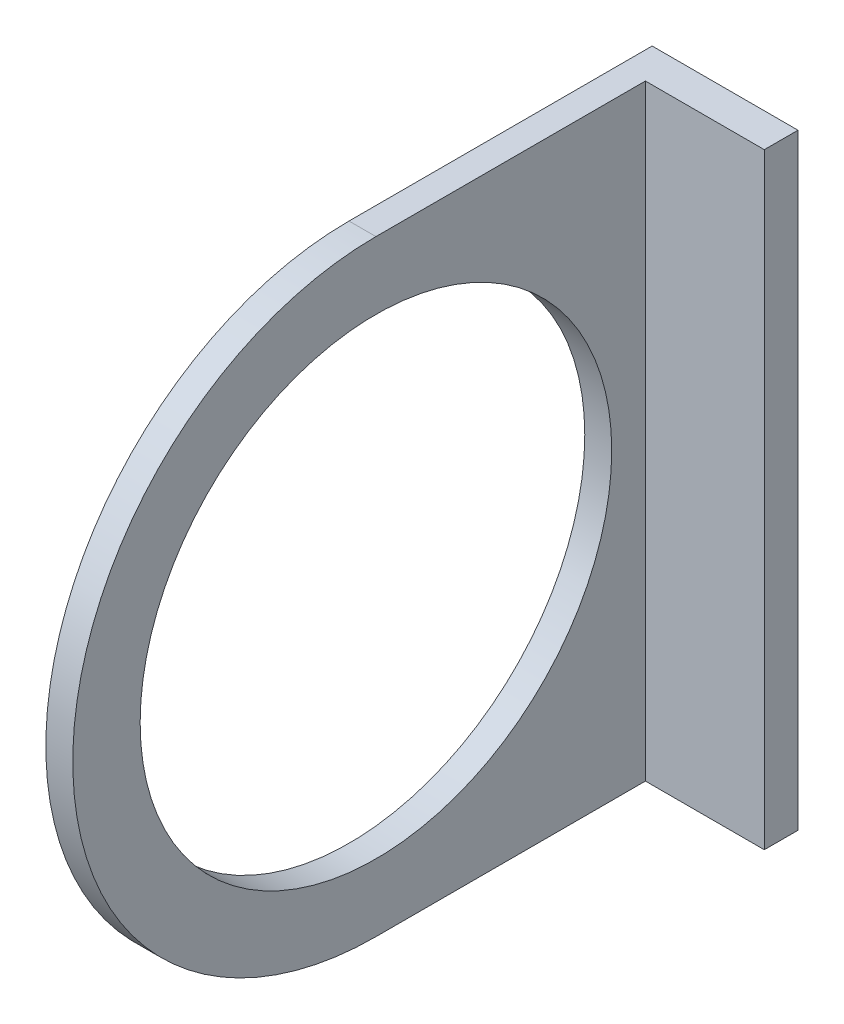
ISO-10303-21;
HEADER;
FILE_DESCRIPTION(('STEP AP214'),'2;1');
FILE_NAME('part.step','',(''),(''),'','','');
FILE_SCHEMA(('AUTOMOTIVE_DESIGN { 1 0 10303 214 1 1 1 1 }'));
ENDSEC;
DATA;
#1=APPLICATION_CONTEXT('core data for automotive mechanical design processes');
#2=APPLICATION_PROTOCOL_DEFINITION('international standard','automotive_design',2000,#1);
#3=PRODUCT_CONTEXT('',#1,'mechanical');
#4=PRODUCT('Part','Part','',(#3));
#5=PRODUCT_RELATED_PRODUCT_CATEGORY('part','',(#4));
#6=PRODUCT_DEFINITION_FORMATION('','',#4);
#7=PRODUCT_DEFINITION_CONTEXT('part definition',#1,'design');
#8=PRODUCT_DEFINITION('design','',#6,#7);
#9=PRODUCT_DEFINITION_SHAPE('','',#8);
#10=(LENGTH_UNIT() NAMED_UNIT(*) SI_UNIT(.MILLI.,.METRE.));
#11=(NAMED_UNIT(*) PLANE_ANGLE_UNIT() SI_UNIT($,.RADIAN.));
#12=(NAMED_UNIT(*) SI_UNIT($,.STERADIAN.) SOLID_ANGLE_UNIT());
#13=UNCERTAINTY_MEASURE_WITH_UNIT(LENGTH_MEASURE(1.E-05),#10,'distance_accuracy_value','');
#14=(GEOMETRIC_REPRESENTATION_CONTEXT(3) GLOBAL_UNCERTAINTY_ASSIGNED_CONTEXT((#13)) GLOBAL_UNIT_ASSIGNED_CONTEXT((#10,
#11,#12)) REPRESENTATION_CONTEXT('',''));
#15=CARTESIAN_POINT('',(0.,0.,0.));
#16=DIRECTION('',(0.,0.,1.));
#17=DIRECTION('',(1.,0.,0.));
#18=AXIS2_PLACEMENT_3D('',#15,#16,#17);
#19=CARTESIAN_POINT('',(0.,180.,0.));
#20=DIRECTION('',(0.,-1.,0.));
#21=DIRECTION('',(0.,0.,-1.));
#22=AXIS2_PLACEMENT_3D('',#19,#20,#21);
#23=PLANE('',#22);
#24=DIRECTION('',(1.,0.,0.));
#25=VECTOR('',#24,1.);
#26=CARTESIAN_POINT('',(-172.,180.,90.));
#27=LINE('',#26,#25);
#28=CARTESIAN_POINT('',(-1.11022302462516E-13,180.,90.));
#29=VERTEX_POINT('',#28);
#30=CARTESIAN_POINT('',(7.99999999999998,180.,90.));
#31=VERTEX_POINT('',#30);
#32=EDGE_CURVE('E97',#29,#31,#27,.T.);
#33=ORIENTED_EDGE('',*,*,#32,.T.);
#34=DIRECTION('',(0.,0.,-1.));
#35=VECTOR('',#34,1.);
#36=CARTESIAN_POINT('',(7.99999999999997,180.,10.));
#37=LINE('',#36,#35);
#38=CARTESIAN_POINT('',(7.99999999999997,180.,10.));
#39=VERTEX_POINT('',#38);
#40=EDGE_CURVE('E86',#31,#39,#37,.T.);
#41=ORIENTED_EDGE('',*,*,#40,.T.);
#42=DIRECTION('',(1.,0.,0.));
#43=VECTOR('',#42,1.);
#44=CARTESIAN_POINT('',(43.3000000000001,180.,10.));
#45=LINE('',#44,#43);
#46=CARTESIAN_POINT('',(43.3000000000001,180.,10.));
#47=VERTEX_POINT('',#46);
#48=EDGE_CURVE('E108',#39,#47,#45,.T.);
#49=ORIENTED_EDGE('',*,*,#48,.T.);
#50=DIRECTION('',(0.,0.,-1.));
#51=VECTOR('',#50,1.);
#52=CARTESIAN_POINT('',(43.3000000000001,180.,0.));
#53=LINE('',#52,#51);
#54=CARTESIAN_POINT('',(43.3000000000001,180.,0.));
#55=VERTEX_POINT('',#54);
#56=EDGE_CURVE('E110',#47,#55,#53,.T.);
#57=ORIENTED_EDGE('',*,*,#56,.T.);
#58=DIRECTION('',(-1.,0.,0.));
#59=VECTOR('',#58,1.);
#60=CARTESIAN_POINT('',(0.,180.,0.));
#61=LINE('',#60,#59);
#62=CARTESIAN_POINT('',(0.,180.,0.));
#63=VERTEX_POINT('',#62);
#64=EDGE_CURVE('E58',#55,#63,#61,.T.);
#65=ORIENTED_EDGE('',*,*,#64,.T.);
#66=DIRECTION('',(0.,0.,1.));
#67=VECTOR('',#66,1.);
#68=CARTESIAN_POINT('',(0.,180.,300.));
#69=LINE('',#68,#67);
#70=EDGE_CURVE('E102',#63,#29,#69,.T.);
#71=ORIENTED_EDGE('',*,*,#70,.T.);
#72=EDGE_LOOP('',(#33,#41,#49,#57,#65,#71));
#73=FACE_BOUND('',#72,.T.);
#74=ADVANCED_FACE('F35',(#73),#23,.F.);
#75=CARTESIAN_POINT('',(0.,0.,0.));
#76=DIRECTION('',(0.,-1.,0.));
#77=DIRECTION('',(0.,0.,-1.));
#78=AXIS2_PLACEMENT_3D('',#75,#76,#77);
#79=PLANE('',#78);
#80=DIRECTION('',(0.,0.,-1.));
#81=VECTOR('',#80,1.);
#82=CARTESIAN_POINT('',(7.99999999999997,0.,10.));
#83=LINE('',#82,#81);
#84=CARTESIAN_POINT('',(7.99999999999998,0.,90.));
#85=VERTEX_POINT('',#84);
#86=CARTESIAN_POINT('',(7.99999999999997,0.,10.));
#87=VERTEX_POINT('',#86);
#88=EDGE_CURVE('E121',#85,#87,#83,.T.);
#89=ORIENTED_EDGE('',*,*,#88,.F.);
#90=DIRECTION('',(1.,0.,0.));
#91=VECTOR('',#90,1.);
#92=CARTESIAN_POINT('',(-172.,0.,90.));
#93=LINE('',#92,#91);
#94=CARTESIAN_POINT('',(0.,0.,90.));
#95=VERTEX_POINT('',#94);
#96=EDGE_CURVE('E11',#85,#95,#93,.F.);
#97=ORIENTED_EDGE('',*,*,#96,.T.);
#98=DIRECTION('',(0.,0.,1.));
#99=VECTOR('',#98,1.);
#100=CARTESIAN_POINT('',(0.,0.,300.));
#101=LINE('',#100,#99);
#102=CARTESIAN_POINT('',(0.,0.,0.));
#103=VERTEX_POINT('',#102);
#104=EDGE_CURVE('E118',#103,#95,#101,.T.);
#105=ORIENTED_EDGE('',*,*,#104,.F.);
#106=DIRECTION('',(-1.,0.,0.));
#107=VECTOR('',#106,1.);
#108=CARTESIAN_POINT('',(0.,0.,0.));
#109=LINE('',#108,#107);
#110=CARTESIAN_POINT('',(43.3000000000001,0.,0.));
#111=VERTEX_POINT('',#110);
#112=EDGE_CURVE('E79',#111,#103,#109,.T.);
#113=ORIENTED_EDGE('',*,*,#112,.F.);
#114=DIRECTION('',(0.,0.,-1.));
#115=VECTOR('',#114,1.);
#116=CARTESIAN_POINT('',(43.3000000000001,0.,0.));
#117=LINE('',#116,#115);
#118=CARTESIAN_POINT('',(43.3000000000001,0.,10.));
#119=VERTEX_POINT('',#118);
#120=EDGE_CURVE('E126',#119,#111,#117,.T.);
#121=ORIENTED_EDGE('',*,*,#120,.F.);
#122=DIRECTION('',(1.,0.,0.));
#123=VECTOR('',#122,1.);
#124=CARTESIAN_POINT('',(43.3000000000001,0.,10.));
#125=LINE('',#124,#123);
#126=EDGE_CURVE('E124',#87,#119,#125,.T.);
#127=ORIENTED_EDGE('',*,*,#126,.F.);
#128=EDGE_LOOP('',(#89,#97,#105,#113,#121,#127));
#129=FACE_BOUND('',#128,.T.);
#130=ADVANCED_FACE('F140',(#129),#79,.T.);
#131=CARTESIAN_POINT('',(0.,180.,300.));
#132=DIRECTION('',(1.,0.,0.));
#133=DIRECTION('',(0.,0.,-1.));
#134=AXIS2_PLACEMENT_3D('',#131,#132,#133);
#135=PLANE('',#134);
#136=CARTESIAN_POINT('',(0.,90.,90.));
#137=DIRECTION('',(1.,0.,0.));
#138=DIRECTION('',(0.,0.,-1.));
#139=AXIS2_PLACEMENT_3D('',#136,#137,#138);
#140=CIRCLE('',#139,70.);
#141=CARTESIAN_POINT('',(0.,90.,20.));
#142=VERTEX_POINT('',#141);
#143=EDGE_CURVE('E122',#142,#142,#140,.T.);
#144=ORIENTED_EDGE('',*,*,#143,.T.);
#145=EDGE_LOOP('',(#144));
#146=FACE_BOUND('',#145,.T.);
#147=ORIENTED_EDGE('',*,*,#104,.T.);
#148=CARTESIAN_POINT('',(0.,90.,90.));
#149=DIRECTION('',(1.,0.,0.));
#150=DIRECTION('',(0.,0.,-1.));
#151=AXIS2_PLACEMENT_3D('',#148,#149,#150);
#152=CIRCLE('',#151,90.);
#153=EDGE_CURVE('E50',#95,#29,#152,.F.);
#154=ORIENTED_EDGE('',*,*,#153,.T.);
#155=ORIENTED_EDGE('',*,*,#70,.F.);
#156=DIRECTION('',(0.,-1.,0.));
#157=VECTOR('',#156,1.);
#158=CARTESIAN_POINT('',(0.,180.,0.));
#159=LINE('',#158,#157);
#160=EDGE_CURVE('E117',#63,#103,#159,.T.);
#161=ORIENTED_EDGE('',*,*,#160,.T.);
#162=EDGE_LOOP('',(#147,#154,#155,#161));
#163=FACE_BOUND('',#162,.T.);
#164=ADVANCED_FACE('F37',(#146,#163),#135,.F.);
#165=CARTESIAN_POINT('',(7.99999999999997,180.,10.));
#166=DIRECTION('',(-1.,0.,0.));
#167=DIRECTION('',(0.,0.,1.));
#168=AXIS2_PLACEMENT_3D('',#165,#166,#167);
#169=PLANE('',#168);
#170=CARTESIAN_POINT('',(7.99999999999998,90.,90.));
#171=DIRECTION('',(1.,0.,0.));
#172=DIRECTION('',(0.,0.,-1.));
#173=AXIS2_PLACEMENT_3D('',#170,#171,#172);
#174=CIRCLE('',#173,70.);
#175=CARTESIAN_POINT('',(7.99999999999995,90.,20.));
#176=VERTEX_POINT('',#175);
#177=EDGE_CURVE('E103',#176,#176,#174,.T.);
#178=ORIENTED_EDGE('',*,*,#177,.F.);
#179=EDGE_LOOP('',(#178));
#180=FACE_BOUND('',#179,.T.);
#181=ORIENTED_EDGE('',*,*,#40,.F.);
#182=CARTESIAN_POINT('',(7.99999999999998,90.,90.));
#183=DIRECTION('',(-1.,0.,0.));
#184=DIRECTION('',(0.,0.,-1.));
#185=AXIS2_PLACEMENT_3D('',#182,#183,#184);
#186=CIRCLE('',#185,90.);
#187=EDGE_CURVE('E95',#85,#31,#186,.T.);
#188=ORIENTED_EDGE('',*,*,#187,.F.);
#189=ORIENTED_EDGE('',*,*,#88,.T.);
#190=DIRECTION('',(0.,-1.,0.));
#191=VECTOR('',#190,1.);
#192=CARTESIAN_POINT('',(7.99999999999997,180.,10.));
#193=LINE('',#192,#191);
#194=EDGE_CURVE('E43',#39,#87,#193,.T.);
#195=ORIENTED_EDGE('',*,*,#194,.F.);
#196=EDGE_LOOP('',(#181,#188,#189,#195));
#197=FACE_BOUND('',#196,.T.);
#198=ADVANCED_FACE('F105',(#180,#197),#169,.F.);
#199=CARTESIAN_POINT('',(43.3000000000001,180.,10.));
#200=DIRECTION('',(0.,0.,-1.));
#201=DIRECTION('',(-1.,0.,0.));
#202=AXIS2_PLACEMENT_3D('',#199,#200,#201);
#203=PLANE('',#202);
#204=ORIENTED_EDGE('',*,*,#126,.T.);
#205=DIRECTION('',(0.,-1.,0.));
#206=VECTOR('',#205,1.);
#207=CARTESIAN_POINT('',(43.3000000000001,180.,10.));
#208=LINE('',#207,#206);
#209=EDGE_CURVE('E132',#47,#119,#208,.T.);
#210=ORIENTED_EDGE('',*,*,#209,.F.);
#211=ORIENTED_EDGE('',*,*,#48,.F.);
#212=ORIENTED_EDGE('',*,*,#194,.T.);
#213=EDGE_LOOP('',(#204,#210,#211,#212));
#214=FACE_BOUND('',#213,.T.);
#215=ADVANCED_FACE('F136',(#214),#203,.F.);
#216=CARTESIAN_POINT('',(43.3000000000001,180.,0.));
#217=DIRECTION('',(-1.,0.,0.));
#218=DIRECTION('',(0.,0.,1.));
#219=AXIS2_PLACEMENT_3D('',#216,#217,#218);
#220=PLANE('',#219);
#221=ORIENTED_EDGE('',*,*,#120,.T.);
#222=DIRECTION('',(0.,-1.,0.));
#223=VECTOR('',#222,1.);
#224=CARTESIAN_POINT('',(43.3000000000001,180.,0.));
#225=LINE('',#224,#223);
#226=EDGE_CURVE('E130',#55,#111,#225,.T.);
#227=ORIENTED_EDGE('',*,*,#226,.F.);
#228=ORIENTED_EDGE('',*,*,#56,.F.);
#229=ORIENTED_EDGE('',*,*,#209,.T.);
#230=EDGE_LOOP('',(#221,#227,#228,#229));
#231=FACE_BOUND('',#230,.T.);
#232=ADVANCED_FACE('F144',(#231),#220,.F.);
#233=CARTESIAN_POINT('',(0.,180.,0.));
#234=DIRECTION('',(0.,0.,1.));
#235=DIRECTION('',(1.,0.,0.));
#236=AXIS2_PLACEMENT_3D('',#233,#234,#235);
#237=PLANE('',#236);
#238=ORIENTED_EDGE('',*,*,#112,.T.);
#239=ORIENTED_EDGE('',*,*,#160,.F.);
#240=ORIENTED_EDGE('',*,*,#64,.F.);
#241=ORIENTED_EDGE('',*,*,#226,.T.);
#242=EDGE_LOOP('',(#238,#239,#240,#241));
#243=FACE_BOUND('',#242,.T.);
#244=ADVANCED_FACE('F146',(#243),#237,.F.);
#245=CARTESIAN_POINT('',(-172.,90.,90.));
#246=DIRECTION('',(1.,0.,0.));
#247=DIRECTION('',(0.,0.,-1.));
#248=AXIS2_PLACEMENT_3D('',#245,#246,#247);
#249=CYLINDRICAL_SURFACE('',#248,90.);
#250=ORIENTED_EDGE('',*,*,#96,.F.);
#251=ORIENTED_EDGE('',*,*,#187,.T.);
#252=ORIENTED_EDGE('',*,*,#32,.F.);
#253=ORIENTED_EDGE('',*,*,#153,.F.);
#254=EDGE_LOOP('',(#250,#251,#252,#253));
#255=FACE_BOUND('',#254,.T.);
#256=ADVANCED_FACE('F96',(#255),#249,.T.);
#257=CARTESIAN_POINT('',(-172.,90.,90.));
#258=DIRECTION('',(1.,0.,0.));
#259=DIRECTION('',(0.,0.,-1.));
#260=AXIS2_PLACEMENT_3D('',#257,#258,#259);
#261=CYLINDRICAL_SURFACE('',#260,70.);
#262=CARTESIAN_POINT('',(7.99999999999995,90.,20.));
#263=CARTESIAN_POINT('',(7.91666666666662,90.,20.));
#264=CARTESIAN_POINT('',(7.83333333333328,90.,20.));
#265=CARTESIAN_POINT('',(7.66666666666662,90.,20.));
#266=CARTESIAN_POINT('',(7.58333333333329,90.,20.));
#267=CARTESIAN_POINT('',(7.41666666666662,90.,20.));
#268=CARTESIAN_POINT('',(7.33333333333328,90.,20.));
#269=CARTESIAN_POINT('',(7.16666666666662,90.,20.));
#270=CARTESIAN_POINT('',(7.08333333333328,90.,20.));
#271=CARTESIAN_POINT('',(6.91666666666662,90.,20.));
#272=CARTESIAN_POINT('',(6.83333333333328,90.,20.));
#273=CARTESIAN_POINT('',(6.66666666666662,90.,20.));
#274=CARTESIAN_POINT('',(6.58333333333328,90.,20.));
#275=CARTESIAN_POINT('',(6.41666666666662,90.,20.));
#276=CARTESIAN_POINT('',(6.33333333333328,90.,20.));
#277=CARTESIAN_POINT('',(6.16666666666662,90.,20.));
#278=CARTESIAN_POINT('',(6.08333333333328,90.,20.));
#279=CARTESIAN_POINT('',(5.91666666666662,90.,20.));
#280=CARTESIAN_POINT('',(5.83333333333328,90.,20.));
#281=CARTESIAN_POINT('',(5.66666666666662,90.,20.));
#282=CARTESIAN_POINT('',(5.58333333333328,90.,20.));
#283=CARTESIAN_POINT('',(5.41666666666662,90.,20.));
#284=CARTESIAN_POINT('',(5.33333333333328,90.,20.));
#285=CARTESIAN_POINT('',(5.16666666666662,90.,20.));
#286=CARTESIAN_POINT('',(5.08333333333328,90.,20.));
#287=CARTESIAN_POINT('',(4.91666666666662,90.,20.));
#288=CARTESIAN_POINT('',(4.83333333333328,90.,20.));
#289=CARTESIAN_POINT('',(4.66666666666662,90.,20.));
#290=CARTESIAN_POINT('',(4.58333333333328,90.,20.));
#291=CARTESIAN_POINT('',(4.41666666666661,90.,20.));
#292=CARTESIAN_POINT('',(4.33333333333328,90.,20.));
#293=CARTESIAN_POINT('',(4.16666666666661,90.,20.));
#294=CARTESIAN_POINT('',(4.08333333333328,90.,20.));
#295=CARTESIAN_POINT('',(3.91666666666661,90.,20.));
#296=CARTESIAN_POINT('',(3.83333333333328,90.,20.));
#297=CARTESIAN_POINT('',(3.66666666666661,90.,20.));
#298=CARTESIAN_POINT('',(3.58333333333328,90.,20.));
#299=CARTESIAN_POINT('',(3.41666666666661,90.,20.));
#300=CARTESIAN_POINT('',(3.33333333333328,90.,20.));
#301=CARTESIAN_POINT('',(3.16666666666661,90.,20.));
#302=CARTESIAN_POINT('',(3.08333333333328,90.,20.));
#303=CARTESIAN_POINT('',(2.91666666666661,90.,20.));
#304=CARTESIAN_POINT('',(2.83333333333328,90.,20.));
#305=CARTESIAN_POINT('',(2.66666666666661,90.,20.));
#306=CARTESIAN_POINT('',(2.58333333333328,90.,20.));
#307=CARTESIAN_POINT('',(2.41666666666661,90.,20.));
#308=CARTESIAN_POINT('',(2.33333333333328,90.,20.));
#309=CARTESIAN_POINT('',(2.16666666666661,90.,20.));
#310=CARTESIAN_POINT('',(2.08333333333328,90.,20.));
#311=CARTESIAN_POINT('',(1.91666666666661,90.,20.));
#312=CARTESIAN_POINT('',(1.83333333333328,90.,20.));
#313=CARTESIAN_POINT('',(1.66666666666661,90.,20.));
#314=CARTESIAN_POINT('',(1.58333333333328,90.,20.));
#315=CARTESIAN_POINT('',(1.41666666666661,90.,20.));
#316=CARTESIAN_POINT('',(1.33333333333328,90.,20.));
#317=CARTESIAN_POINT('',(1.16666666666661,90.,20.));
#318=CARTESIAN_POINT('',(1.08333333333328,90.,20.));
#319=CARTESIAN_POINT('',(0.916666666666612,90.,20.));
#320=CARTESIAN_POINT('',(0.833333333333279,90.,20.));
#321=CARTESIAN_POINT('',(0.666666666666612,90.,20.));
#322=CARTESIAN_POINT('',(0.583333333333278,90.,20.));
#323=CARTESIAN_POINT('',(0.416666666666612,90.,20.));
#324=CARTESIAN_POINT('',(0.333333333333278,90.,20.));
#325=CARTESIAN_POINT('',(0.166666666666611,90.,20.));
#326=CARTESIAN_POINT('',(0.0833333333332778,90.,20.));
#327=CARTESIAN_POINT('',(0.,90.,20.));
#328=B_SPLINE_CURVE_WITH_KNOTS('',3,(#262,#263,#264,#265,#266,#267,#268,#269,#270,#271,#272,
#273,#274,#275,#276,#277,#278,#279,#280,#281,#282,#283,#284,#285,#286,#287,#288,#289,#290,#291,
#292,#293,#294,#295,#296,#297,#298,#299,#300,#301,#302,#303,#304,#305,#306,#307,#308,#309,#310,
#311,#312,#313,#314,#315,#316,#317,#318,#319,#320,#321,#322,#323,#324,#325,#326,#327),
.UNSPECIFIED.,.F.,.F.,(4,2,2,2,2,2,2,2,2,2,2,2,2,2,2,2,2,2,2,2,2,2,2,2,2,2,2,2,2,2,2,2,4),(0.,
0.25,0.5,0.750000000000001,1.,1.25,1.5,1.75,2.,2.25,2.5,2.75,3.,3.25,3.5,3.75,4.,4.25,4.5,4.75,
5.,5.25,5.50000000000001,5.75000000000001,6.00000000000001,6.25000000000001,6.50000000000001,
6.75000000000001,7.00000000000001,7.25000000000001,7.50000000000001,7.75000000000001,
8.00000000000001),.UNSPECIFIED.);
#329=EDGE_CURVE('BSEAM154',#176,#142,#328,.T.);
#330=ORIENTED_EDGE('',*,*,#177,.T.);
#331=ORIENTED_EDGE('',*,*,#143,.F.);
#332=ORIENTED_EDGE('',*,*,#329,.T.);
#333=ORIENTED_EDGE('',*,*,#329,.F.);
#334=EDGE_LOOP('',(#330,#332,#331,#333));
#335=FACE_BOUND('',#334,.T.);
#336=ADVANCED_FACE('F154',(#335),#261,.F.);
#337=CLOSED_SHELL('',(#74,#130,#164,#198,#215,#232,#244,#256,#336));
#338=MANIFOLD_SOLID_BREP('B2',#337);
#339=ADVANCED_BREP_SHAPE_REPRESENTATION('',(#18,#338),#14);
#340=SHAPE_DEFINITION_REPRESENTATION(#9,#339);
ENDSEC;
END-ISO-10303-21;
